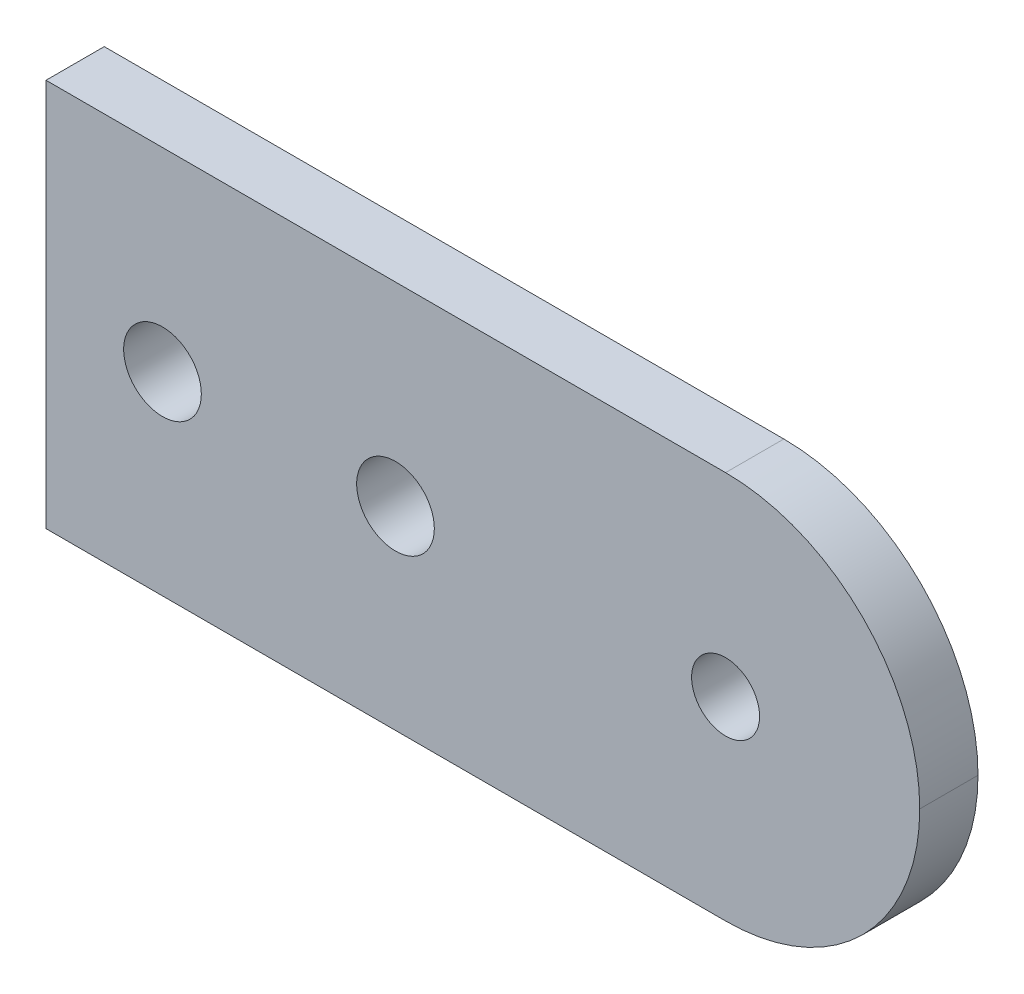
ISO-10303-21;
HEADER;
FILE_DESCRIPTION(('STEP AP214'),'2;1');
FILE_NAME('part.step','',(''),(''),'','','');
FILE_SCHEMA(('AUTOMOTIVE_DESIGN { 1 0 10303 214 1 1 1 1 }'));
ENDSEC;
DATA;
#1=APPLICATION_CONTEXT('core data for automotive mechanical design processes');
#2=APPLICATION_PROTOCOL_DEFINITION('international standard','automotive_design',2000,#1);
#3=PRODUCT_CONTEXT('',#1,'mechanical');
#4=PRODUCT('Part','Part','',(#3));
#5=PRODUCT_RELATED_PRODUCT_CATEGORY('part','',(#4));
#6=PRODUCT_DEFINITION_FORMATION('','',#4);
#7=PRODUCT_DEFINITION_CONTEXT('part definition',#1,'design');
#8=PRODUCT_DEFINITION('design','',#6,#7);
#9=PRODUCT_DEFINITION_SHAPE('','',#8);
#10=(LENGTH_UNIT() NAMED_UNIT(*) SI_UNIT(.MILLI.,.METRE.));
#11=(NAMED_UNIT(*) PLANE_ANGLE_UNIT() SI_UNIT($,.RADIAN.));
#12=(NAMED_UNIT(*) SI_UNIT($,.STERADIAN.) SOLID_ANGLE_UNIT());
#13=UNCERTAINTY_MEASURE_WITH_UNIT(LENGTH_MEASURE(1.E-05),#10,'distance_accuracy_value','');
#14=(GEOMETRIC_REPRESENTATION_CONTEXT(3) GLOBAL_UNCERTAINTY_ASSIGNED_CONTEXT((#13)) GLOBAL_UNIT_ASSIGNED_CONTEXT((#10,
#11,#12)) REPRESENTATION_CONTEXT('',''));
#15=CARTESIAN_POINT('',(0.,0.,0.));
#16=DIRECTION('',(0.,0.,1.));
#17=DIRECTION('',(1.,0.,0.));
#18=AXIS2_PLACEMENT_3D('',#15,#16,#17);
#19=CARTESIAN_POINT('',(0.,0.,3.));
#20=DIRECTION('',(0.,0.,1.));
#21=DIRECTION('',(1.,0.,0.));
#22=AXIS2_PLACEMENT_3D('',#19,#20,#21);
#23=PLANE('',#22);
#24=CARTESIAN_POINT('',(-4.50000000000001,0.,3.));
#25=DIRECTION('',(0.,0.,1.));
#26=DIRECTION('',(1.,0.,0.));
#27=AXIS2_PLACEMENT_3D('',#24,#25,#26);
#28=CIRCLE('',#27,2.);
#29=CARTESIAN_POINT('',(-2.50000000000001,0.,3.));
#30=VERTEX_POINT('',#29);
#31=EDGE_CURVE('E141',#30,#30,#28,.T.);
#32=ORIENTED_EDGE('',*,*,#31,.F.);
#33=EDGE_LOOP('',(#32));
#34=FACE_BOUND('',#33,.T.);
#35=DIRECTION('',(1.,0.,0.));
#36=VECTOR('',#35,1.);
#37=CARTESIAN_POINT('',(-22.5,-10.,3.));
#38=LINE('',#37,#36);
#39=CARTESIAN_POINT('',(-22.5,-10.,3.));
#40=VERTEX_POINT('',#39);
#41=CARTESIAN_POINT('',(12.5,-10.,3.));
#42=VERTEX_POINT('',#41);
#43=EDGE_CURVE('E101',#40,#42,#38,.T.);
#44=ORIENTED_EDGE('',*,*,#43,.T.);
#45=CARTESIAN_POINT('',(12.5,0.,3.));
#46=DIRECTION('',(0.,0.,1.));
#47=DIRECTION('',(1.,0.,0.));
#48=AXIS2_PLACEMENT_3D('',#45,#46,#47);
#49=CIRCLE('',#48,10.);
#50=CARTESIAN_POINT('',(22.5,0.,3.));
#51=VERTEX_POINT('',#50);
#52=EDGE_CURVE('E46',#42,#51,#49,.T.);
#53=ORIENTED_EDGE('',*,*,#52,.T.);
#54=CARTESIAN_POINT('',(12.5,0.,3.));
#55=DIRECTION('',(0.,0.,1.));
#56=DIRECTION('',(1.,0.,0.));
#57=AXIS2_PLACEMENT_3D('',#54,#55,#56);
#58=CIRCLE('',#57,10.);
#59=CARTESIAN_POINT('',(12.5,9.99999999999999,3.));
#60=VERTEX_POINT('',#59);
#61=EDGE_CURVE('E53',#51,#60,#58,.T.);
#62=ORIENTED_EDGE('',*,*,#61,.T.);
#63=DIRECTION('',(-1.,0.,0.));
#64=VECTOR('',#63,1.);
#65=CARTESIAN_POINT('',(-22.5,9.99999999999999,3.));
#66=LINE('',#65,#64);
#67=CARTESIAN_POINT('',(-22.5,9.99999999999999,3.));
#68=VERTEX_POINT('',#67);
#69=EDGE_CURVE('E78',#60,#68,#66,.T.);
#70=ORIENTED_EDGE('',*,*,#69,.T.);
#71=DIRECTION('',(0.,-1.,0.));
#72=VECTOR('',#71,1.);
#73=CARTESIAN_POINT('',(-22.5,9.99999999999999,3.));
#74=LINE('',#73,#72);
#75=EDGE_CURVE('E82',#68,#40,#74,.T.);
#76=ORIENTED_EDGE('',*,*,#75,.T.);
#77=EDGE_LOOP('',(#44,#53,#62,#70,#76));
#78=FACE_BOUND('',#77,.T.);
#79=CARTESIAN_POINT('',(-16.5,0.,3.));
#80=DIRECTION('',(0.,0.,1.));
#81=DIRECTION('',(1.,0.,0.));
#82=AXIS2_PLACEMENT_3D('',#79,#80,#81);
#83=CIRCLE('',#82,2.);
#84=CARTESIAN_POINT('',(-14.5,0.,3.));
#85=VERTEX_POINT('',#84);
#86=EDGE_CURVE('E108',#85,#85,#83,.T.);
#87=ORIENTED_EDGE('',*,*,#86,.F.);
#88=EDGE_LOOP('',(#87));
#89=FACE_BOUND('',#88,.T.);
#90=CARTESIAN_POINT('',(12.5,0.,3.));
#91=DIRECTION('',(0.,0.,1.));
#92=DIRECTION('',(1.,0.,0.));
#93=AXIS2_PLACEMENT_3D('',#90,#91,#92);
#94=CIRCLE('',#93,1.75);
#95=CARTESIAN_POINT('',(14.25,0.,3.));
#96=VERTEX_POINT('',#95);
#97=EDGE_CURVE('E133',#96,#96,#94,.T.);
#98=ORIENTED_EDGE('',*,*,#97,.F.);
#99=EDGE_LOOP('',(#98));
#100=FACE_BOUND('',#99,.T.);
#101=ADVANCED_FACE('F37',(#34,#78,#89,#100),#23,.T.);
#102=CARTESIAN_POINT('',(0.,0.,0.));
#103=DIRECTION('',(0.,0.,1.));
#104=DIRECTION('',(1.,0.,0.));
#105=AXIS2_PLACEMENT_3D('',#102,#103,#104);
#106=PLANE('',#105);
#107=CARTESIAN_POINT('',(12.5,0.,0.));
#108=DIRECTION('',(0.,0.,1.));
#109=DIRECTION('',(1.,0.,0.));
#110=AXIS2_PLACEMENT_3D('',#107,#108,#109);
#111=CIRCLE('',#110,10.);
#112=CARTESIAN_POINT('',(12.5,9.99999999999999,0.));
#113=VERTEX_POINT('',#112);
#114=CARTESIAN_POINT('',(22.5,0.,0.));
#115=VERTEX_POINT('',#114);
#116=EDGE_CURVE('E95',#113,#115,#111,.F.);
#117=ORIENTED_EDGE('',*,*,#116,.T.);
#118=CARTESIAN_POINT('',(12.5,0.,0.));
#119=DIRECTION('',(0.,0.,1.));
#120=DIRECTION('',(1.,0.,0.));
#121=AXIS2_PLACEMENT_3D('',#118,#119,#120);
#122=CIRCLE('',#121,10.);
#123=CARTESIAN_POINT('',(12.5,-10.,0.));
#124=VERTEX_POINT('',#123);
#125=EDGE_CURVE('E114',#115,#124,#122,.F.);
#126=ORIENTED_EDGE('',*,*,#125,.T.);
#127=DIRECTION('',(1.,0.,0.));
#128=VECTOR('',#127,1.);
#129=CARTESIAN_POINT('',(-22.5,-10.,0.));
#130=LINE('',#129,#128);
#131=CARTESIAN_POINT('',(-22.5,-10.,0.));
#132=VERTEX_POINT('',#131);
#133=EDGE_CURVE('E86',#132,#124,#130,.T.);
#134=ORIENTED_EDGE('',*,*,#133,.F.);
#135=DIRECTION('',(0.,-1.,0.));
#136=VECTOR('',#135,1.);
#137=CARTESIAN_POINT('',(-22.5,9.99999999999999,0.));
#138=LINE('',#137,#136);
#139=CARTESIAN_POINT('',(-22.5,9.99999999999999,0.));
#140=VERTEX_POINT('',#139);
#141=EDGE_CURVE('E107',#140,#132,#138,.T.);
#142=ORIENTED_EDGE('',*,*,#141,.F.);
#143=DIRECTION('',(-1.,0.,0.));
#144=VECTOR('',#143,1.);
#145=CARTESIAN_POINT('',(-22.5,9.99999999999999,0.));
#146=LINE('',#145,#144);
#147=EDGE_CURVE('E92',#113,#140,#146,.T.);
#148=ORIENTED_EDGE('',*,*,#147,.F.);
#149=EDGE_LOOP('',(#117,#126,#134,#142,#148));
#150=FACE_BOUND('',#149,.T.);
#151=CARTESIAN_POINT('',(-16.5,0.,0.));
#152=DIRECTION('',(0.,0.,1.));
#153=DIRECTION('',(1.,0.,0.));
#154=AXIS2_PLACEMENT_3D('',#151,#152,#153);
#155=CIRCLE('',#154,2.);
#156=CARTESIAN_POINT('',(-14.5,0.,0.));
#157=VERTEX_POINT('',#156);
#158=EDGE_CURVE('E144',#157,#157,#155,.T.);
#159=ORIENTED_EDGE('',*,*,#158,.T.);
#160=EDGE_LOOP('',(#159));
#161=FACE_BOUND('',#160,.T.);
#162=CARTESIAN_POINT('',(-4.50000000000001,0.,0.));
#163=DIRECTION('',(0.,0.,1.));
#164=DIRECTION('',(1.,0.,0.));
#165=AXIS2_PLACEMENT_3D('',#162,#163,#164);
#166=CIRCLE('',#165,2.);
#167=CARTESIAN_POINT('',(-2.50000000000001,0.,0.));
#168=VERTEX_POINT('',#167);
#169=EDGE_CURVE('E138',#168,#168,#166,.T.);
#170=ORIENTED_EDGE('',*,*,#169,.T.);
#171=EDGE_LOOP('',(#170));
#172=FACE_BOUND('',#171,.T.);
#173=CARTESIAN_POINT('',(12.5,0.,0.));
#174=DIRECTION('',(0.,0.,1.));
#175=DIRECTION('',(1.,0.,0.));
#176=AXIS2_PLACEMENT_3D('',#173,#174,#175);
#177=CIRCLE('',#176,1.75);
#178=CARTESIAN_POINT('',(14.25,0.,0.));
#179=VERTEX_POINT('',#178);
#180=EDGE_CURVE('E131',#179,#179,#177,.T.);
#181=ORIENTED_EDGE('',*,*,#180,.T.);
#182=EDGE_LOOP('',(#181));
#183=FACE_BOUND('',#182,.T.);
#184=ADVANCED_FACE('F151',(#150,#161,#172,#183),#106,.F.);
#185=CARTESIAN_POINT('',(-22.5,9.99999999999999,3.));
#186=DIRECTION('',(0.,-1.,0.));
#187=DIRECTION('',(1.,0.,0.));
#188=AXIS2_PLACEMENT_3D('',#185,#186,#187);
#189=PLANE('',#188);
#190=ORIENTED_EDGE('',*,*,#69,.F.);
#191=DIRECTION('',(0.,0.,-1.));
#192=VECTOR('',#191,1.);
#193=CARTESIAN_POINT('',(12.5,9.99999999999999,3.));
#194=LINE('',#193,#192);
#195=EDGE_CURVE('E11',#60,#113,#194,.T.);
#196=ORIENTED_EDGE('',*,*,#195,.T.);
#197=ORIENTED_EDGE('',*,*,#147,.T.);
#198=DIRECTION('',(0.,0.,-1.));
#199=VECTOR('',#198,1.);
#200=CARTESIAN_POINT('',(-22.5,9.99999999999999,3.));
#201=LINE('',#200,#199);
#202=EDGE_CURVE('E89',#68,#140,#201,.T.);
#203=ORIENTED_EDGE('',*,*,#202,.F.);
#204=EDGE_LOOP('',(#190,#196,#197,#203));
#205=FACE_BOUND('',#204,.T.);
#206=ADVANCED_FACE('F90',(#205),#189,.F.);
#207=CARTESIAN_POINT('',(-22.5,9.99999999999999,3.));
#208=DIRECTION('',(1.,0.,0.));
#209=DIRECTION('',(0.,1.,0.));
#210=AXIS2_PLACEMENT_3D('',#207,#208,#209);
#211=PLANE('',#210);
#212=ORIENTED_EDGE('',*,*,#141,.T.);
#213=DIRECTION('',(0.,0.,-1.));
#214=VECTOR('',#213,1.);
#215=CARTESIAN_POINT('',(-22.5,-10.,3.));
#216=LINE('',#215,#214);
#217=EDGE_CURVE('E96',#40,#132,#216,.T.);
#218=ORIENTED_EDGE('',*,*,#217,.F.);
#219=ORIENTED_EDGE('',*,*,#75,.F.);
#220=ORIENTED_EDGE('',*,*,#202,.T.);
#221=EDGE_LOOP('',(#212,#218,#219,#220));
#222=FACE_BOUND('',#221,.T.);
#223=ADVANCED_FACE('F98',(#222),#211,.F.);
#224=CARTESIAN_POINT('',(-22.5,-10.,3.));
#225=DIRECTION('',(0.,1.,0.));
#226=DIRECTION('',(-1.,0.,0.));
#227=AXIS2_PLACEMENT_3D('',#224,#225,#226);
#228=PLANE('',#227);
#229=ORIENTED_EDGE('',*,*,#133,.T.);
#230=DIRECTION('',(0.,0.,-1.));
#231=VECTOR('',#230,1.);
#232=CARTESIAN_POINT('',(12.5,-10.,3.));
#233=LINE('',#232,#231);
#234=EDGE_CURVE('E116',#124,#42,#233,.F.);
#235=ORIENTED_EDGE('',*,*,#234,.T.);
#236=ORIENTED_EDGE('',*,*,#43,.F.);
#237=ORIENTED_EDGE('',*,*,#217,.T.);
#238=EDGE_LOOP('',(#229,#235,#236,#237));
#239=FACE_BOUND('',#238,.T.);
#240=ADVANCED_FACE('F122',(#239),#228,.F.);
#241=CARTESIAN_POINT('',(-16.5,0.,3.));
#242=DIRECTION('',(0.,0.,-1.));
#243=DIRECTION('',(-1.,0.,0.));
#244=AXIS2_PLACEMENT_3D('',#241,#242,#243);
#245=CYLINDRICAL_SURFACE('',#244,2.);
#246=ORIENTED_EDGE('',*,*,#86,.T.);
#247=EDGE_LOOP('',(#246));
#248=FACE_BOUND('',#247,.T.);
#249=ORIENTED_EDGE('',*,*,#158,.F.);
#250=EDGE_LOOP('',(#249));
#251=FACE_BOUND('',#250,.T.);
#252=ADVANCED_FACE('F154',(#248,#251),#245,.F.);
#253=CARTESIAN_POINT('',(-4.50000000000001,0.,3.));
#254=DIRECTION('',(0.,0.,-1.));
#255=DIRECTION('',(-1.,0.,0.));
#256=AXIS2_PLACEMENT_3D('',#253,#254,#255);
#257=CYLINDRICAL_SURFACE('',#256,2.);
#258=ORIENTED_EDGE('',*,*,#31,.T.);
#259=EDGE_LOOP('',(#258));
#260=FACE_BOUND('',#259,.T.);
#261=ORIENTED_EDGE('',*,*,#169,.F.);
#262=EDGE_LOOP('',(#261));
#263=FACE_BOUND('',#262,.T.);
#264=ADVANCED_FACE('F156',(#260,#263),#257,.F.);
#265=CARTESIAN_POINT('',(12.5,0.,3.));
#266=DIRECTION('',(0.,0.,-1.));
#267=DIRECTION('',(-1.,0.,0.));
#268=AXIS2_PLACEMENT_3D('',#265,#266,#267);
#269=CYLINDRICAL_SURFACE('',#268,1.75);
#270=ORIENTED_EDGE('',*,*,#97,.T.);
#271=EDGE_LOOP('',(#270));
#272=FACE_BOUND('',#271,.T.);
#273=ORIENTED_EDGE('',*,*,#180,.F.);
#274=EDGE_LOOP('',(#273));
#275=FACE_BOUND('',#274,.T.);
#276=ADVANCED_FACE('F163',(#272,#275),#269,.F.);
#277=CARTESIAN_POINT('',(12.5,0.,3.));
#278=DIRECTION('',(0.,0.,-1.));
#279=DIRECTION('',(-1.,0.,0.));
#280=AXIS2_PLACEMENT_3D('',#277,#278,#279);
#281=CYLINDRICAL_SURFACE('',#280,10.);
#282=ORIENTED_EDGE('',*,*,#195,.F.);
#283=ORIENTED_EDGE('',*,*,#61,.F.);
#284=DIRECTION('',(0.,0.,-1.));
#285=VECTOR('',#284,1.);
#286=CARTESIAN_POINT('',(22.5,0.,3.));
#287=LINE('',#286,#285);
#288=EDGE_CURVE('E41',#115,#51,#287,.F.);
#289=ORIENTED_EDGE('',*,*,#288,.F.);
#290=ORIENTED_EDGE('',*,*,#116,.F.);
#291=EDGE_LOOP('',(#282,#283,#289,#290));
#292=FACE_BOUND('',#291,.T.);
#293=ADVANCED_FACE('F39',(#292),#281,.T.);
#294=CARTESIAN_POINT('',(12.5,0.,3.));
#295=DIRECTION('',(0.,0.,-1.));
#296=DIRECTION('',(-1.,0.,0.));
#297=AXIS2_PLACEMENT_3D('',#294,#295,#296);
#298=CYLINDRICAL_SURFACE('',#297,10.);
#299=ORIENTED_EDGE('',*,*,#52,.F.);
#300=ORIENTED_EDGE('',*,*,#234,.F.);
#301=ORIENTED_EDGE('',*,*,#125,.F.);
#302=ORIENTED_EDGE('',*,*,#288,.T.);
#303=EDGE_LOOP('',(#299,#300,#301,#302));
#304=FACE_BOUND('',#303,.T.);
#305=ADVANCED_FACE('F126',(#304),#298,.T.);
#306=CLOSED_SHELL('',(#101,#184,#206,#223,#240,#252,#264,#276,#293,#305));
#307=MANIFOLD_SOLID_BREP('B2',#306);
#308=ADVANCED_BREP_SHAPE_REPRESENTATION('',(#18,#307),#14);
#309=SHAPE_DEFINITION_REPRESENTATION(#9,#308);
ENDSEC;
END-ISO-10303-21;
